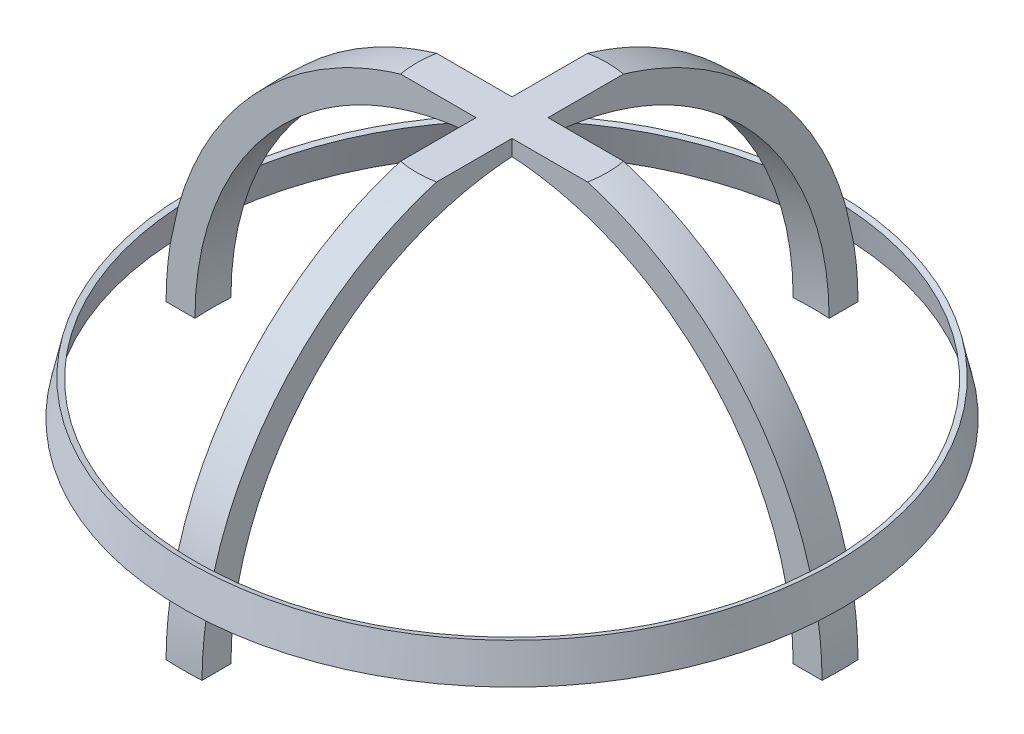
ISO-10303-21;
HEADER;
FILE_DESCRIPTION(('STEP AP214'),'2;1');
FILE_NAME('part.step','',(''),(''),'','','');
FILE_SCHEMA(('AUTOMOTIVE_DESIGN { 1 0 10303 214 1 1 1 1 }'));
ENDSEC;
DATA;
#1=APPLICATION_CONTEXT('core data for automotive mechanical design processes');
#2=APPLICATION_PROTOCOL_DEFINITION('international standard','automotive_design',2000,#1);
#3=PRODUCT_CONTEXT('',#1,'mechanical');
#4=PRODUCT('Part','Part','',(#3));
#5=PRODUCT_RELATED_PRODUCT_CATEGORY('part','',(#4));
#6=PRODUCT_DEFINITION_FORMATION('','',#4);
#7=PRODUCT_DEFINITION_CONTEXT('part definition',#1,'design');
#8=PRODUCT_DEFINITION('design','',#6,#7);
#9=PRODUCT_DEFINITION_SHAPE('','',#8);
#10=(LENGTH_UNIT() NAMED_UNIT(*) SI_UNIT(.MILLI.,.METRE.));
#11=(NAMED_UNIT(*) PLANE_ANGLE_UNIT() SI_UNIT($,.RADIAN.));
#12=(NAMED_UNIT(*) SI_UNIT($,.STERADIAN.) SOLID_ANGLE_UNIT());
#13=UNCERTAINTY_MEASURE_WITH_UNIT(LENGTH_MEASURE(1.E-05),#10,'distance_accuracy_value','');
#14=(GEOMETRIC_REPRESENTATION_CONTEXT(3) GLOBAL_UNCERTAINTY_ASSIGNED_CONTEXT((#13)) GLOBAL_UNIT_ASSIGNED_CONTEXT((#10,
#11,#12)) REPRESENTATION_CONTEXT('',''));
#15=CARTESIAN_POINT('',(0.,0.,0.));
#16=DIRECTION('',(0.,0.,1.));
#17=DIRECTION('',(1.,0.,0.));
#18=AXIS2_PLACEMENT_3D('',#15,#16,#17);
#19=CARTESIAN_POINT('',(0.,0.,0.));
#20=DIRECTION('',(0.,-1.,0.));
#21=DIRECTION('',(-1.,0.,0.));
#22=AXIS2_PLACEMENT_3D('',#19,#20,#21);
#23=SPHERICAL_SURFACE('',#22,54.8098082626001);
#24=CARTESIAN_POINT('',(0.,14.7077334629583,0.));
#25=DIRECTION('',(0.,-1.,0.));
#26=DIRECTION('',(0.,0.,-1.));
#27=AXIS2_PLACEMENT_3D('',#24,#25,#26);
#28=CIRCLE('',#27,52.7995990341363);
#29=CARTESIAN_POINT('',(-52.7143022164343,14.7077334629583,3.));
#30=VERTEX_POINT('',#29);
#31=CARTESIAN_POINT('',(-52.7143022164343,14.7077334629583,-3.));
#32=VERTEX_POINT('',#31);
#33=EDGE_CURVE('E250',#30,#32,#28,.T.);
#34=ORIENTED_EDGE('',*,*,#33,.F.);
#35=CARTESIAN_POINT('',(0.,0.,3.));
#36=DIRECTION('',(0.,0.,-1.));
#37=DIRECTION('',(-1.,0.,0.));
#38=AXIS2_PLACEMENT_3D('',#35,#36,#37);
#39=CIRCLE('',#38,54.7276445846429);
#40=CARTESIAN_POINT('',(-15.5977671461923,52.4578377541064,3.));
#41=VERTEX_POINT('',#40);
#42=EDGE_CURVE('E470',#30,#41,#39,.T.);
#43=ORIENTED_EDGE('',*,*,#42,.T.);
#44=CARTESIAN_POINT('',(0.,52.4578377541064,0.));
#45=DIRECTION('',(0.,-1.,0.));
#46=DIRECTION('',(0.,0.,-1.));
#47=AXIS2_PLACEMENT_3D('',#44,#45,#46);
#48=CIRCLE('',#47,15.8836500826113);
#49=CARTESIAN_POINT('',(-15.5977671461923,52.4578377541064,-3.));
#50=VERTEX_POINT('',#49);
#51=EDGE_CURVE('E424',#41,#50,#48,.T.);
#52=ORIENTED_EDGE('',*,*,#51,.T.);
#53=CARTESIAN_POINT('',(0.,0.,-3.));
#54=DIRECTION('',(0.,0.,1.));
#55=DIRECTION('',(1.,0.,0.));
#56=AXIS2_PLACEMENT_3D('',#53,#54,#55);
#57=CIRCLE('',#56,54.7276445846429);
#58=EDGE_CURVE('E515',#50,#32,#57,.T.);
#59=ORIENTED_EDGE('',*,*,#58,.T.);
#60=EDGE_LOOP('',(#34,#43,#52,#59));
#61=FACE_BOUND('',#60,.T.);
#62=ADVANCED_FACE('F39',(#61),#23,.T.);
#63=CARTESIAN_POINT('',(0.,8.84829183377712,0.));
#64=DIRECTION('',(0.,-1.,0.));
#65=DIRECTION('',(0.,0.,-1.));
#66=AXIS2_PLACEMENT_3D('',#63,#64,#65);
#67=CIRCLE('',#66,54.0908755097133);
#68=CARTESIAN_POINT('',(-54.0076181052942,8.84829183377719,3.));
#69=VERTEX_POINT('',#68);
#70=CARTESIAN_POINT('',(-54.0076181052942,8.84829183377712,-3.));
#71=VERTEX_POINT('',#70);
#72=EDGE_CURVE('E372',#69,#71,#67,.T.);
#73=ORIENTED_EDGE('',*,*,#72,.T.);
#74=CARTESIAN_POINT('',(-54.7276445846429,0.,-3.));
#75=VERTEX_POINT('',#74);
#76=EDGE_CURVE('E514',#71,#75,#57,.T.);
#77=ORIENTED_EDGE('',*,*,#76,.T.);
#78=CARTESIAN_POINT('',(0.,0.,0.));
#79=DIRECTION('',(0.,-1.,0.));
#80=DIRECTION('',(0.,0.,-1.));
#81=AXIS2_PLACEMENT_3D('',#78,#79,#80);
#82=CIRCLE('',#81,54.8098082626001);
#83=CARTESIAN_POINT('',(-54.7276445846429,0.,3.));
#84=VERTEX_POINT('',#83);
#85=EDGE_CURVE('E419',#84,#75,#82,.T.);
#86=ORIENTED_EDGE('',*,*,#85,.F.);
#87=EDGE_CURVE('E471',#84,#69,#39,.T.);
#88=ORIENTED_EDGE('',*,*,#87,.T.);
#89=EDGE_LOOP('',(#73,#77,#86,#88));
#90=FACE_BOUND('',#89,.T.);
#91=ADVANCED_FACE('F338',(#90),#23,.T.);
#92=CARTESIAN_POINT('',(-3.,14.7077334629583,-52.7143022164343));
#93=VERTEX_POINT('',#92);
#94=CARTESIAN_POINT('',(3.,14.7077334629583,-52.7143022164343));
#95=VERTEX_POINT('',#94);
#96=EDGE_CURVE('E245',#93,#95,#28,.T.);
#97=ORIENTED_EDGE('',*,*,#96,.F.);
#98=CARTESIAN_POINT('',(-3.,0.,0.));
#99=DIRECTION('',(1.,0.,0.));
#100=DIRECTION('',(0.,0.,-1.));
#101=AXIS2_PLACEMENT_3D('',#98,#99,#100);
#102=CIRCLE('',#101,54.7276445846429);
#103=CARTESIAN_POINT('',(-3.,52.4578377541064,-15.5977671461923));
#104=VERTEX_POINT('',#103);
#105=EDGE_CURVE('E465',#93,#104,#102,.T.);
#106=ORIENTED_EDGE('',*,*,#105,.T.);
#107=CARTESIAN_POINT('',(3.,52.4578377541064,-15.5977671461923));
#108=VERTEX_POINT('',#107);
#109=EDGE_CURVE('E526',#104,#108,#48,.T.);
#110=ORIENTED_EDGE('',*,*,#109,.T.);
#111=CARTESIAN_POINT('',(3.,0.,0.));
#112=DIRECTION('',(-1.,0.,0.));
#113=DIRECTION('',(0.,0.,1.));
#114=AXIS2_PLACEMENT_3D('',#111,#112,#113);
#115=CIRCLE('',#114,54.7276445846429);
#116=EDGE_CURVE('E507',#108,#95,#115,.T.);
#117=ORIENTED_EDGE('',*,*,#116,.T.);
#118=EDGE_LOOP('',(#97,#106,#110,#117));
#119=FACE_BOUND('',#118,.T.);
#120=ADVANCED_FACE('F344',(#119),#23,.T.);
#121=CARTESIAN_POINT('',(-3.,8.84829183377719,-54.0076181052942));
#122=VERTEX_POINT('',#121);
#123=CARTESIAN_POINT('',(3.,8.84829183377712,-54.0076181052942));
#124=VERTEX_POINT('',#123);
#125=EDGE_CURVE('E246',#122,#124,#67,.T.);
#126=ORIENTED_EDGE('',*,*,#125,.T.);
#127=CARTESIAN_POINT('',(3.,0.,-54.7276445846429));
#128=VERTEX_POINT('',#127);
#129=EDGE_CURVE('E506',#124,#128,#115,.T.);
#130=ORIENTED_EDGE('',*,*,#129,.T.);
#131=CARTESIAN_POINT('',(-3.,0.,-54.7276445846429));
#132=VERTEX_POINT('',#131);
#133=EDGE_CURVE('E534',#132,#128,#82,.T.);
#134=ORIENTED_EDGE('',*,*,#133,.F.);
#135=EDGE_CURVE('E460',#132,#122,#102,.T.);
#136=ORIENTED_EDGE('',*,*,#135,.T.);
#137=EDGE_LOOP('',(#126,#130,#134,#136));
#138=FACE_BOUND('',#137,.T.);
#139=ADVANCED_FACE('F549',(#138),#23,.T.);
#140=CARTESIAN_POINT('',(52.7143022164343,14.7077334629583,-3.));
#141=VERTEX_POINT('',#140);
#142=CARTESIAN_POINT('',(52.7143022164343,14.7077334629583,3.));
#143=VERTEX_POINT('',#142);
#144=EDGE_CURVE('E220',#141,#143,#28,.T.);
#145=ORIENTED_EDGE('',*,*,#144,.F.);
#146=CARTESIAN_POINT('',(0.,0.,-3.));
#147=DIRECTION('',(0.,0.,1.));
#148=DIRECTION('',(1.,0.,0.));
#149=AXIS2_PLACEMENT_3D('',#146,#147,#148);
#150=CIRCLE('',#149,54.7276445846429);
#151=CARTESIAN_POINT('',(15.5977671461923,52.4578377541064,-3.));
#152=VERTEX_POINT('',#151);
#153=EDGE_CURVE('E205',#141,#152,#150,.T.);
#154=ORIENTED_EDGE('',*,*,#153,.T.);
#155=CARTESIAN_POINT('',(15.5977671461923,52.4578377541064,3.));
#156=VERTEX_POINT('',#155);
#157=EDGE_CURVE('E418',#152,#156,#48,.T.);
#158=ORIENTED_EDGE('',*,*,#157,.T.);
#159=CARTESIAN_POINT('',(0.,0.,3.));
#160=DIRECTION('',(0.,0.,-1.));
#161=DIRECTION('',(-1.,0.,0.));
#162=AXIS2_PLACEMENT_3D('',#159,#160,#161);
#163=CIRCLE('',#162,54.7276445846429);
#164=EDGE_CURVE('E223',#156,#143,#163,.T.);
#165=ORIENTED_EDGE('',*,*,#164,.T.);
#166=EDGE_LOOP('',(#145,#154,#158,#165));
#167=FACE_BOUND('',#166,.T.);
#168=ADVANCED_FACE('F221',(#167),#23,.T.);
#169=CARTESIAN_POINT('',(54.0076181052942,8.84829183377719,-3.));
#170=VERTEX_POINT('',#169);
#171=CARTESIAN_POINT('',(54.0076181052942,8.84829183377712,3.));
#172=VERTEX_POINT('',#171);
#173=EDGE_CURVE('E375',#170,#172,#67,.T.);
#174=ORIENTED_EDGE('',*,*,#173,.T.);
#175=CARTESIAN_POINT('',(54.7276445846429,0.,3.));
#176=VERTEX_POINT('',#175);
#177=EDGE_CURVE('E392',#172,#176,#163,.T.);
#178=ORIENTED_EDGE('',*,*,#177,.T.);
#179=CARTESIAN_POINT('',(54.7276445846429,0.,-3.));
#180=VERTEX_POINT('',#179);
#181=EDGE_CURVE('E413',#180,#176,#82,.T.);
#182=ORIENTED_EDGE('',*,*,#181,.F.);
#183=EDGE_CURVE('E215',#180,#170,#150,.T.);
#184=ORIENTED_EDGE('',*,*,#183,.T.);
#185=EDGE_LOOP('',(#174,#178,#182,#184));
#186=FACE_BOUND('',#185,.T.);
#187=ADVANCED_FACE('F354',(#186),#23,.T.);
#188=CARTESIAN_POINT('',(3.,14.7077334629583,52.7143022164343));
#189=VERTEX_POINT('',#188);
#190=CARTESIAN_POINT('',(-3.,14.7077334629583,52.7143022164343));
#191=VERTEX_POINT('',#190);
#192=EDGE_CURVE('E59',#189,#191,#28,.T.);
#193=ORIENTED_EDGE('',*,*,#192,.F.);
#194=CARTESIAN_POINT('',(3.,0.,0.));
#195=DIRECTION('',(-1.,0.,0.));
#196=DIRECTION('',(0.,0.,1.));
#197=AXIS2_PLACEMENT_3D('',#194,#195,#196);
#198=CIRCLE('',#197,54.7276445846429);
#199=CARTESIAN_POINT('',(3.,52.4578377541064,15.5977671461923));
#200=VERTEX_POINT('',#199);
#201=EDGE_CURVE('E407',#189,#200,#198,.T.);
#202=ORIENTED_EDGE('',*,*,#201,.T.);
#203=CARTESIAN_POINT('',(-3.,52.4578377541064,15.5977671461923));
#204=VERTEX_POINT('',#203);
#205=EDGE_CURVE('E420',#200,#204,#48,.T.);
#206=ORIENTED_EDGE('',*,*,#205,.T.);
#207=CARTESIAN_POINT('',(-3.,0.,0.));
#208=DIRECTION('',(1.,0.,0.));
#209=DIRECTION('',(0.,0.,-1.));
#210=AXIS2_PLACEMENT_3D('',#207,#208,#209);
#211=CIRCLE('',#210,54.7276445846429);
#212=EDGE_CURVE('E462',#204,#191,#211,.T.);
#213=ORIENTED_EDGE('',*,*,#212,.T.);
#214=EDGE_LOOP('',(#193,#202,#206,#213));
#215=FACE_BOUND('',#214,.T.);
#216=ADVANCED_FACE('F348',(#215),#23,.T.);
#217=CARTESIAN_POINT('',(3.,8.84829183377719,54.0076181052942));
#218=VERTEX_POINT('',#217);
#219=CARTESIAN_POINT('',(-3.,8.84829183377712,54.0076181052942));
#220=VERTEX_POINT('',#219);
#221=EDGE_CURVE('E357',#218,#220,#67,.T.);
#222=ORIENTED_EDGE('',*,*,#221,.T.);
#223=CARTESIAN_POINT('',(-3.,0.,54.7276445846429));
#224=VERTEX_POINT('',#223);
#225=EDGE_CURVE('E359',#220,#224,#211,.T.);
#226=ORIENTED_EDGE('',*,*,#225,.T.);
#227=CARTESIAN_POINT('',(3.,0.,54.7276445846429));
#228=VERTEX_POINT('',#227);
#229=EDGE_CURVE('E415',#228,#224,#82,.T.);
#230=ORIENTED_EDGE('',*,*,#229,.F.);
#231=EDGE_CURVE('E361',#228,#218,#198,.T.);
#232=ORIENTED_EDGE('',*,*,#231,.T.);
#233=EDGE_LOOP('',(#222,#226,#230,#232));
#234=FACE_BOUND('',#233,.T.);
#235=ADVANCED_FACE('F340',(#234),#23,.T.);
#236=CARTESIAN_POINT('',(3.,-47.5421622458936,16.5280143442534));
#237=DIRECTION('',(-1.,0.,0.));
#238=DIRECTION('',(0.,0.,1.));
#239=AXIS2_PLACEMENT_3D('',#236,#237,#238);
#240=PLANE('',#239);
#241=CARTESIAN_POINT('',(3.,-78.4607083011719,73.2702358494606));
#242=CARTESIAN_POINT('',(3.,-70.841456450407,71.5897329981205));
#243=CARTESIAN_POINT('',(3.,-63.2222244824851,69.909140007067));
#244=CARTESIAN_POINT('',(3.,-47.983811227918,66.5477242185315));
#245=CARTESIAN_POINT('',(3.,-40.3646299412731,64.8669014210492));
#246=CARTESIAN_POINT('',(3.,-17.5071788666337,59.8240141144965));
#247=CARTESIAN_POINT('',(3.,-2.26900150710761,56.4615306126234));
#248=CARTESIAN_POINT('',(3.,20.5879508588435,51.4163833156868));
#249=CARTESIAN_POINT('',(3.,28.2068827991617,49.734430521214));
#250=CARTESIAN_POINT('',(3.,43.44460333828,46.369875862958));
#251=CARTESIAN_POINT('',(3.,51.0633919370807,44.6872739991771));
#252=CARTESIAN_POINT('',(3.,66.3007709097612,41.3211720179606));
#253=CARTESIAN_POINT('',(3.,73.9193612836363,39.6376719005038));
#254=CARTESIAN_POINT('',(3.,85.3470297795611,37.1114395676625));
#255=CARTESIAN_POINT('',(3.,89.1562164570464,36.2691984255194));
#256=CARTESIAN_POINT('',(3.,96.7744991384305,34.5843060963235));
#257=CARTESIAN_POINT('',(3.,100.583595142329,33.7416549092692));
#258=CARTESIAN_POINT('',(3.,104.392636643225,32.8987573716095));
#259=B_SPLINE_CURVE_WITH_KNOTS('',3,(#241,#242,#243,#244,#245,#246,#247,#248,#249,#250,#251,
#252,#253,#254,#255,#256,#257,#258),.UNSPECIFIED.,.F.,.F.,(4,2,2,2,2,2,2,2,4),(0.,
23.4071313316642,46.8142626972976,93.6285243323567,117.035655747289,140.442787077746,
163.849918964681,175.553485049434,187.257051178928),.UNSPECIFIED.);
#260=EDGE_CURVE('E66',#218,#189,#259,.T.);
#261=ORIENTED_EDGE('',*,*,#260,.F.);
#262=ORIENTED_EDGE('',*,*,#231,.F.);
#263=DIRECTION('',(0.,0.,1.));
#264=VECTOR('',#263,1.);
#265=CARTESIAN_POINT('',(3.,0.,0.));
#266=LINE('',#265,#264);
#267=CARTESIAN_POINT('',(3.,0.,49.9099188538711));
#268=VERTEX_POINT('',#267);
#269=EDGE_CURVE('E400',#268,#228,#266,.T.);
#270=ORIENTED_EDGE('',*,*,#269,.F.);
#271=CARTESIAN_POINT('',(3.,0.,0.));
#272=DIRECTION('',(-1.,0.,0.));
#273=DIRECTION('',(0.,0.,1.));
#274=AXIS2_PLACEMENT_3D('',#271,#272,#273);
#275=CIRCLE('',#274,49.9099188538711);
#276=CARTESIAN_POINT('',(3.,49.8196748283246,3.));
#277=VERTEX_POINT('',#276);
#278=EDGE_CURVE('E426',#268,#277,#275,.T.);
#279=ORIENTED_EDGE('',*,*,#278,.T.);
#280=DIRECTION('',(0.,1.,0.));
#281=VECTOR('',#280,1.);
#282=CARTESIAN_POINT('',(3.,-47.5421622458936,3.));
#283=LINE('',#282,#281);
#284=CARTESIAN_POINT('',(3.,52.4578377541064,3.));
#285=VERTEX_POINT('',#284);
#286=EDGE_CURVE('E401',#277,#285,#283,.T.);
#287=ORIENTED_EDGE('',*,*,#286,.T.);
#288=DIRECTION('',(0.,0.,1.));
#289=VECTOR('',#288,1.);
#290=CARTESIAN_POINT('',(3.,52.4578377541064,16.5280143442534));
#291=LINE('',#290,#289);
#292=EDGE_CURVE('E477',#285,#200,#291,.T.);
#293=ORIENTED_EDGE('',*,*,#292,.T.);
#294=ORIENTED_EDGE('',*,*,#201,.F.);
#295=EDGE_LOOP('',(#261,#262,#270,#279,#287,#293,#294));
#296=FACE_BOUND('',#295,.T.);
#297=ADVANCED_FACE('F279',(#296),#240,.F.);
#298=CARTESIAN_POINT('',(3.,-47.5421622458936,3.));
#299=DIRECTION('',(0.,0.,-1.));
#300=DIRECTION('',(-1.,0.,0.));
#301=AXIS2_PLACEMENT_3D('',#298,#299,#300);
#302=PLANE('',#301);
#303=CARTESIAN_POINT('',(32.8987573716095,104.392636643225,3.));
#304=CARTESIAN_POINT('',(33.8776869663045,99.9688576139226,3.));
#305=CARTESIAN_POINT('',(34.8562875455616,95.5450057967239,3.));
#306=CARTESIAN_POINT('',(36.8129534164412,86.6971838056494,3.));
#307=CARTESIAN_POINT('',(37.7910187080662,82.2732136317742,3.));
#308=CARTESIAN_POINT('',(40.724595749769,69.0011664788794,3.));
#309=CARTESIAN_POINT('',(42.6794886978138,60.1529527278342,3.));
#310=CARTESIAN_POINT('',(46.0450316885042,44.9154503158348,3.));
#311=CARTESIAN_POINT('',(47.4559405567881,38.5262188147569,3.));
#312=CARTESIAN_POINT('',(50.2773215311637,25.7476593381671,3.));
#313=CARTESIAN_POINT('',(51.6877936372528,19.3583313626546,3.));
#314=CARTESIAN_POINT('',(56.4615305515347,-2.26900185158538,3.));
#315=CARTESIAN_POINT('',(59.8240142277862,-17.5071795045442,3.));
#316=CARTESIAN_POINT('',(64.866901608454,-40.3646307287639,3.));
#317=CARTESIAN_POINT('',(66.5477243645427,-47.9838118587946,3.));
#318=CARTESIAN_POINT('',(69.9091400702767,-63.2222248000766,3.));
#319=CARTESIAN_POINT('',(71.5897330199224,-70.8414566113279,3.));
#320=CARTESIAN_POINT('',(73.2702358494606,-78.4607083011719,3.));
#321=B_SPLINE_CURVE_WITH_KNOTS('',3,(#303,#304,#305,#306,#307,#308,#309,#310,#311,#312,#313,
#314,#315,#316,#317,#318,#319,#320),.UNSPECIFIED.,.F.,.F.,(4,2,2,2,2,2,2,2,4),(0.,
13.5923918192086,27.1847835711406,54.3695666425258,73.9990466815697,93.6285268420098,
140.442789448223,163.849920328366,187.257051174366),.UNSPECIFIED.);
#322=EDGE_CURVE('E238',#143,#172,#321,.T.);
#323=ORIENTED_EDGE('',*,*,#322,.F.);
#324=ORIENTED_EDGE('',*,*,#164,.F.);
#325=DIRECTION('',(-1.,0.,0.));
#326=VECTOR('',#325,1.);
#327=CARTESIAN_POINT('',(3.,52.4578377541064,3.));
#328=LINE('',#327,#326);
#329=EDGE_CURVE('E474',#156,#285,#328,.T.);
#330=ORIENTED_EDGE('',*,*,#329,.T.);
#331=ORIENTED_EDGE('',*,*,#286,.F.);
#332=CARTESIAN_POINT('',(0.,0.,3.));
#333=DIRECTION('',(0.,0.,-1.));
#334=DIRECTION('',(-1.,0.,0.));
#335=AXIS2_PLACEMENT_3D('',#332,#333,#334);
#336=CIRCLE('',#335,49.9099188538711);
#337=CARTESIAN_POINT('',(49.9099188538711,0.,3.));
#338=VERTEX_POINT('',#337);
#339=EDGE_CURVE('E423',#277,#338,#336,.T.);
#340=ORIENTED_EDGE('',*,*,#339,.T.);
#341=DIRECTION('',(-1.,0.,0.));
#342=VECTOR('',#341,1.);
#343=CARTESIAN_POINT('',(0.,0.,3.));
#344=LINE('',#343,#342);
#345=EDGE_CURVE('E398',#176,#338,#344,.T.);
#346=ORIENTED_EDGE('',*,*,#345,.F.);
#347=ORIENTED_EDGE('',*,*,#177,.F.);
#348=EDGE_LOOP('',(#323,#324,#330,#331,#340,#346,#347));
#349=FACE_BOUND('',#348,.T.);
#350=ADVANCED_FACE('F326',(#349),#302,.F.);
#351=CARTESIAN_POINT('',(3.,-47.5421622458936,-3.));
#352=DIRECTION('',(0.,0.,1.));
#353=DIRECTION('',(1.,0.,0.));
#354=AXIS2_PLACEMENT_3D('',#351,#352,#353);
#355=PLANE('',#354);
#356=CARTESIAN_POINT('',(73.2702358494606,-78.4607083011719,-3.));
#357=CARTESIAN_POINT('',(71.5897329981205,-70.841456450407,-3.));
#358=CARTESIAN_POINT('',(69.909140007067,-63.2222244824851,-3.));
#359=CARTESIAN_POINT('',(66.5477242185315,-47.983811227918,-3.));
#360=CARTESIAN_POINT('',(64.8669014210492,-40.3646299412731,-3.));
#361=CARTESIAN_POINT('',(59.8240141144965,-17.5071788666337,-3.));
#362=CARTESIAN_POINT('',(56.4615306126234,-2.26900150710761,-3.));
#363=CARTESIAN_POINT('',(51.4163833156868,20.5879508588435,-3.));
#364=CARTESIAN_POINT('',(49.734430521214,28.2068827991617,-3.));
#365=CARTESIAN_POINT('',(46.369875862958,43.44460333828,-3.));
#366=CARTESIAN_POINT('',(44.6872739991771,51.0633919370807,-3.));
#367=CARTESIAN_POINT('',(41.3211720179606,66.3007709097612,-3.));
#368=CARTESIAN_POINT('',(39.6376719005038,73.9193612836363,-3.));
#369=CARTESIAN_POINT('',(37.1114395676625,85.3470297795611,-3.));
#370=CARTESIAN_POINT('',(36.2691984255194,89.1562164570464,-3.));
#371=CARTESIAN_POINT('',(34.5843060963235,96.7744991384305,-3.));
#372=CARTESIAN_POINT('',(33.7416549092692,100.583595142329,-3.));
#373=CARTESIAN_POINT('',(32.8987573716095,104.392636643225,-3.));
#374=B_SPLINE_CURVE_WITH_KNOTS('',3,(#356,#357,#358,#359,#360,#361,#362,#363,#364,#365,#366,
#367,#368,#369,#370,#371,#372,#373),.UNSPECIFIED.,.F.,.F.,(4,2,2,2,2,2,2,2,4),(0.,
23.4071313316642,46.8142626972976,93.6285243323567,117.035655747289,140.442787077746,
163.849918964681,175.553485049434,187.257051178928),.UNSPECIFIED.);
#375=EDGE_CURVE('E209',#170,#141,#374,.T.);
#376=ORIENTED_EDGE('',*,*,#375,.F.);
#377=ORIENTED_EDGE('',*,*,#183,.F.);
#378=DIRECTION('',(1.,0.,0.));
#379=VECTOR('',#378,1.);
#380=CARTESIAN_POINT('',(0.,0.,-3.));
#381=LINE('',#380,#379);
#382=CARTESIAN_POINT('',(49.9099188538711,0.,-3.));
#383=VERTEX_POINT('',#382);
#384=EDGE_CURVE('E216',#383,#180,#381,.T.);
#385=ORIENTED_EDGE('',*,*,#384,.F.);
#386=CARTESIAN_POINT('',(0.,0.,-3.));
#387=DIRECTION('',(0.,0.,1.));
#388=DIRECTION('',(1.,0.,0.));
#389=AXIS2_PLACEMENT_3D('',#386,#387,#388);
#390=CIRCLE('',#389,49.9099188538711);
#391=CARTESIAN_POINT('',(3.,49.8196748283246,-3.));
#392=VERTEX_POINT('',#391);
#393=EDGE_CURVE('E431',#383,#392,#390,.T.);
#394=ORIENTED_EDGE('',*,*,#393,.T.);
#395=DIRECTION('',(0.,1.,0.));
#396=VECTOR('',#395,1.);
#397=CARTESIAN_POINT('',(3.,-47.5421622458936,-3.));
#398=LINE('',#397,#396);
#399=CARTESIAN_POINT('',(3.,52.4578377541064,-3.));
#400=VERTEX_POINT('',#399);
#401=EDGE_CURVE('E498',#392,#400,#398,.T.);
#402=ORIENTED_EDGE('',*,*,#401,.T.);
#403=DIRECTION('',(1.,0.,0.));
#404=VECTOR('',#403,1.);
#405=CARTESIAN_POINT('',(3.,52.4578377541064,-3.));
#406=LINE('',#405,#404);
#407=EDGE_CURVE('E212',#400,#152,#406,.T.);
#408=ORIENTED_EDGE('',*,*,#407,.T.);
#409=ORIENTED_EDGE('',*,*,#153,.F.);
#410=EDGE_LOOP('',(#376,#377,#385,#394,#402,#408,#409));
#411=FACE_BOUND('',#410,.T.);
#412=ADVANCED_FACE('F207',(#411),#355,.F.);
#413=CARTESIAN_POINT('',(3.,-47.5421622458936,-3.));
#414=DIRECTION('',(-1.,0.,0.));
#415=DIRECTION('',(0.,0.,1.));
#416=AXIS2_PLACEMENT_3D('',#413,#414,#415);
#417=PLANE('',#416);
#418=CARTESIAN_POINT('',(3.,104.392636643225,-32.8987573716095));
#419=CARTESIAN_POINT('',(3.,99.9688576139226,-33.8776869663045));
#420=CARTESIAN_POINT('',(3.,95.5450057967239,-34.8562875455616));
#421=CARTESIAN_POINT('',(3.,86.6971838056494,-36.8129534164412));
#422=CARTESIAN_POINT('',(3.,82.2732136317742,-37.7910187080662));
#423=CARTESIAN_POINT('',(3.,69.0011664788794,-40.724595749769));
#424=CARTESIAN_POINT('',(3.,60.1529527278342,-42.6794886978138));
#425=CARTESIAN_POINT('',(3.,44.9154503158348,-46.0450316885042));
#426=CARTESIAN_POINT('',(3.,38.5262188147569,-47.4559405567881));
#427=CARTESIAN_POINT('',(3.,25.7476593381671,-50.2773215311637));
#428=CARTESIAN_POINT('',(3.,19.3583313626546,-51.6877936372528));
#429=CARTESIAN_POINT('',(3.,-2.26900185158538,-56.4615305515347));
#430=CARTESIAN_POINT('',(3.,-17.5071795045442,-59.8240142277862));
#431=CARTESIAN_POINT('',(3.,-40.3646307287639,-64.866901608454));
#432=CARTESIAN_POINT('',(3.,-47.9838118587946,-66.5477243645427));
#433=CARTESIAN_POINT('',(3.,-63.2222248000766,-69.9091400702767));
#434=CARTESIAN_POINT('',(3.,-70.8414566113279,-71.5897330199224));
#435=CARTESIAN_POINT('',(3.,-78.4607083011719,-73.2702358494606));
#436=B_SPLINE_CURVE_WITH_KNOTS('',3,(#418,#419,#420,#421,#422,#423,#424,#425,#426,#427,#428,
#429,#430,#431,#432,#433,#434,#435),.UNSPECIFIED.,.F.,.F.,(4,2,2,2,2,2,2,2,4),(0.,
13.5923918192086,27.1847835711406,54.3695666425258,73.9990466815697,93.6285268420098,
140.442789448223,163.849920328366,187.257051174366),.UNSPECIFIED.);
#437=EDGE_CURVE('E239',#95,#124,#436,.T.);
#438=ORIENTED_EDGE('',*,*,#437,.F.);
#439=ORIENTED_EDGE('',*,*,#116,.F.);
#440=DIRECTION('',(0.,0.,1.));
#441=VECTOR('',#440,1.);
#442=CARTESIAN_POINT('',(3.,52.4578377541064,-3.));
#443=LINE('',#442,#441);
#444=EDGE_CURVE('E263',#108,#400,#443,.T.);
#445=ORIENTED_EDGE('',*,*,#444,.T.);
#446=ORIENTED_EDGE('',*,*,#401,.F.);
#447=CARTESIAN_POINT('',(3.,0.,0.));
#448=DIRECTION('',(-1.,0.,0.));
#449=DIRECTION('',(0.,0.,1.));
#450=AXIS2_PLACEMENT_3D('',#447,#448,#449);
#451=CIRCLE('',#450,49.9099188538711);
#452=CARTESIAN_POINT('',(3.,0.,-49.9099188538711));
#453=VERTEX_POINT('',#452);
#454=EDGE_CURVE('E429',#392,#453,#451,.T.);
#455=ORIENTED_EDGE('',*,*,#454,.T.);
#456=DIRECTION('',(0.,0.,1.));
#457=VECTOR('',#456,1.);
#458=CARTESIAN_POINT('',(3.,0.,0.));
#459=LINE('',#458,#457);
#460=EDGE_CURVE('E491',#128,#453,#459,.T.);
#461=ORIENTED_EDGE('',*,*,#460,.F.);
#462=ORIENTED_EDGE('',*,*,#129,.F.);
#463=EDGE_LOOP('',(#438,#439,#445,#446,#455,#461,#462));
#464=FACE_BOUND('',#463,.T.);
#465=ADVANCED_FACE('F325',(#464),#417,.F.);
#466=CARTESIAN_POINT('',(-3.,-47.5421622458936,-16.5280143442534));
#467=DIRECTION('',(1.,0.,0.));
#468=DIRECTION('',(0.,0.,-1.));
#469=AXIS2_PLACEMENT_3D('',#466,#467,#468);
#470=PLANE('',#469);
#471=CARTESIAN_POINT('',(-3.,-78.4607083011719,-73.2702358494606));
#472=CARTESIAN_POINT('',(-3.,-70.841456450407,-71.5897329981205));
#473=CARTESIAN_POINT('',(-3.,-63.2222244824851,-69.909140007067));
#474=CARTESIAN_POINT('',(-3.,-47.983811227918,-66.5477242185315));
#475=CARTESIAN_POINT('',(-3.,-40.3646299412731,-64.8669014210492));
#476=CARTESIAN_POINT('',(-3.,-17.5071788666337,-59.8240141144965));
#477=CARTESIAN_POINT('',(-3.,-2.26900150710761,-56.4615306126234));
#478=CARTESIAN_POINT('',(-3.,20.5879508588435,-51.4163833156868));
#479=CARTESIAN_POINT('',(-3.,28.2068827991617,-49.734430521214));
#480=CARTESIAN_POINT('',(-3.,43.44460333828,-46.369875862958));
#481=CARTESIAN_POINT('',(-3.,51.0633919370807,-44.6872739991771));
#482=CARTESIAN_POINT('',(-3.,66.3007709097612,-41.3211720179606));
#483=CARTESIAN_POINT('',(-3.,73.9193612836363,-39.6376719005038));
#484=CARTESIAN_POINT('',(-3.,85.3470297795611,-37.1114395676625));
#485=CARTESIAN_POINT('',(-3.,89.1562164570464,-36.2691984255194));
#486=CARTESIAN_POINT('',(-3.,96.7744991384305,-34.5843060963235));
#487=CARTESIAN_POINT('',(-3.,100.583595142329,-33.7416549092692));
#488=CARTESIAN_POINT('',(-3.,104.392636643225,-32.8987573716095));
#489=B_SPLINE_CURVE_WITH_KNOTS('',3,(#471,#472,#473,#474,#475,#476,#477,#478,#479,#480,#481,
#482,#483,#484,#485,#486,#487,#488),.UNSPECIFIED.,.F.,.F.,(4,2,2,2,2,2,2,2,4),(0.,
23.4071313316642,46.8142626972976,93.6285243323567,117.035655747289,140.442787077746,
163.849918964681,175.553485049434,187.257051178928),.UNSPECIFIED.);
#490=EDGE_CURVE('E309',#122,#93,#489,.T.);
#491=ORIENTED_EDGE('',*,*,#490,.F.);
#492=ORIENTED_EDGE('',*,*,#135,.F.);
#493=DIRECTION('',(0.,0.,-1.));
#494=VECTOR('',#493,1.);
#495=CARTESIAN_POINT('',(-3.,0.,0.));
#496=LINE('',#495,#494);
#497=CARTESIAN_POINT('',(-3.,0.,-49.9099188538711));
#498=VERTEX_POINT('',#497);
#499=EDGE_CURVE('E517',#498,#132,#496,.T.);
#500=ORIENTED_EDGE('',*,*,#499,.F.);
#501=CARTESIAN_POINT('',(-3.,0.,0.));
#502=DIRECTION('',(1.,0.,0.));
#503=DIRECTION('',(0.,0.,-1.));
#504=AXIS2_PLACEMENT_3D('',#501,#502,#503);
#505=CIRCLE('',#504,49.9099188538711);
#506=CARTESIAN_POINT('',(-3.,49.8196748283246,-3.));
#507=VERTEX_POINT('',#506);
#508=EDGE_CURVE('E436',#498,#507,#505,.T.);
#509=ORIENTED_EDGE('',*,*,#508,.T.);
#510=DIRECTION('',(0.,1.,0.));
#511=VECTOR('',#510,1.);
#512=CARTESIAN_POINT('',(-3.,-47.5421622458936,-3.));
#513=LINE('',#512,#511);
#514=CARTESIAN_POINT('',(-3.,52.4578377541064,-3.));
#515=VERTEX_POINT('',#514);
#516=EDGE_CURVE('E487',#507,#515,#513,.T.);
#517=ORIENTED_EDGE('',*,*,#516,.T.);
#518=DIRECTION('',(0.,0.,-1.));
#519=VECTOR('',#518,1.);
#520=CARTESIAN_POINT('',(-3.,52.4578377541064,-16.5280143442534));
#521=LINE('',#520,#519);
#522=EDGE_CURVE('E497',#515,#104,#521,.T.);
#523=ORIENTED_EDGE('',*,*,#522,.T.);
#524=ORIENTED_EDGE('',*,*,#105,.F.);
#525=EDGE_LOOP('',(#491,#492,#500,#509,#517,#523,#524));
#526=FACE_BOUND('',#525,.T.);
#527=ADVANCED_FACE('F331',(#526),#470,.F.);
#528=CARTESIAN_POINT('',(-3.,-47.5421622458936,-3.));
#529=DIRECTION('',(0.,0.,1.));
#530=DIRECTION('',(1.,0.,0.));
#531=AXIS2_PLACEMENT_3D('',#528,#529,#530);
#532=PLANE('',#531);
#533=CARTESIAN_POINT('',(-32.8987573716095,104.392636643225,-3.));
#534=CARTESIAN_POINT('',(-33.8776869663045,99.9688576139226,-3.));
#535=CARTESIAN_POINT('',(-34.8562875455616,95.5450057967239,-3.));
#536=CARTESIAN_POINT('',(-36.8129534164412,86.6971838056494,-3.));
#537=CARTESIAN_POINT('',(-37.7910187080662,82.2732136317742,-3.));
#538=CARTESIAN_POINT('',(-40.724595749769,69.0011664788794,-3.));
#539=CARTESIAN_POINT('',(-42.6794886978138,60.1529527278342,-3.));
#540=CARTESIAN_POINT('',(-46.0450316885042,44.9154503158348,-3.));
#541=CARTESIAN_POINT('',(-47.4559405567881,38.5262188147569,-3.));
#542=CARTESIAN_POINT('',(-50.2773215311637,25.7476593381671,-3.));
#543=CARTESIAN_POINT('',(-51.6877936372528,19.3583313626546,-3.));
#544=CARTESIAN_POINT('',(-56.4615305515347,-2.26900185158538,-3.));
#545=CARTESIAN_POINT('',(-59.8240142277862,-17.5071795045442,-3.));
#546=CARTESIAN_POINT('',(-64.866901608454,-40.3646307287639,-3.));
#547=CARTESIAN_POINT('',(-66.5477243645427,-47.9838118587946,-3.));
#548=CARTESIAN_POINT('',(-69.9091400702767,-63.2222248000766,-3.));
#549=CARTESIAN_POINT('',(-71.5897330199224,-70.8414566113279,-3.));
#550=CARTESIAN_POINT('',(-73.2702358494606,-78.4607083011719,-3.));
#551=B_SPLINE_CURVE_WITH_KNOTS('',3,(#533,#534,#535,#536,#537,#538,#539,#540,#541,#542,#543,
#544,#545,#546,#547,#548,#549,#550),.UNSPECIFIED.,.F.,.F.,(4,2,2,2,2,2,2,2,4),(0.,
13.5923918192086,27.1847835711406,54.3695666425258,73.9990466815697,93.6285268420098,
140.442789448223,163.849920328366,187.257051174366),.UNSPECIFIED.);
#552=EDGE_CURVE('E302',#32,#71,#551,.T.);
#553=ORIENTED_EDGE('',*,*,#552,.F.);
#554=ORIENTED_EDGE('',*,*,#58,.F.);
#555=DIRECTION('',(1.,0.,0.));
#556=VECTOR('',#555,1.);
#557=CARTESIAN_POINT('',(-3.,52.4578377541064,-3.));
#558=LINE('',#557,#556);
#559=EDGE_CURVE('E494',#50,#515,#558,.T.);
#560=ORIENTED_EDGE('',*,*,#559,.T.);
#561=ORIENTED_EDGE('',*,*,#516,.F.);
#562=CARTESIAN_POINT('',(0.,0.,-3.));
#563=DIRECTION('',(0.,0.,1.));
#564=DIRECTION('',(1.,0.,0.));
#565=AXIS2_PLACEMENT_3D('',#562,#563,#564);
#566=CIRCLE('',#565,49.9099188538711);
#567=CARTESIAN_POINT('',(-49.9099188538711,0.,-3.));
#568=VERTEX_POINT('',#567);
#569=EDGE_CURVE('E434',#507,#568,#566,.T.);
#570=ORIENTED_EDGE('',*,*,#569,.T.);
#571=DIRECTION('',(1.,0.,0.));
#572=VECTOR('',#571,1.);
#573=CARTESIAN_POINT('',(0.,0.,-3.));
#574=LINE('',#573,#572);
#575=EDGE_CURVE('E511',#75,#568,#574,.T.);
#576=ORIENTED_EDGE('',*,*,#575,.F.);
#577=ORIENTED_EDGE('',*,*,#76,.F.);
#578=EDGE_LOOP('',(#553,#554,#560,#561,#570,#576,#577));
#579=FACE_BOUND('',#578,.T.);
#580=ADVANCED_FACE('F327',(#579),#532,.F.);
#581=CARTESIAN_POINT('',(-16.5280143442534,-47.5421622458936,3.));
#582=DIRECTION('',(0.,0.,-1.));
#583=DIRECTION('',(-1.,0.,0.));
#584=AXIS2_PLACEMENT_3D('',#581,#582,#583);
#585=PLANE('',#584);
#586=CARTESIAN_POINT('',(-73.2702358494606,-78.4607083011719,3.));
#587=CARTESIAN_POINT('',(-71.5897329981205,-70.841456450407,3.));
#588=CARTESIAN_POINT('',(-69.909140007067,-63.2222244824851,3.));
#589=CARTESIAN_POINT('',(-66.5477242185315,-47.983811227918,3.));
#590=CARTESIAN_POINT('',(-64.8669014210492,-40.3646299412731,3.));
#591=CARTESIAN_POINT('',(-59.8240141144965,-17.5071788666337,3.));
#592=CARTESIAN_POINT('',(-56.4615306126234,-2.26900150710761,3.));
#593=CARTESIAN_POINT('',(-51.4163833156868,20.5879508588435,3.));
#594=CARTESIAN_POINT('',(-49.734430521214,28.2068827991617,3.));
#595=CARTESIAN_POINT('',(-46.369875862958,43.44460333828,3.));
#596=CARTESIAN_POINT('',(-44.6872739991771,51.0633919370807,3.));
#597=CARTESIAN_POINT('',(-41.3211720179606,66.3007709097612,3.));
#598=CARTESIAN_POINT('',(-39.6376719005038,73.9193612836363,3.));
#599=CARTESIAN_POINT('',(-37.1114395676625,85.3470297795611,3.));
#600=CARTESIAN_POINT('',(-36.2691984255194,89.1562164570464,3.));
#601=CARTESIAN_POINT('',(-34.5843060963235,96.7744991384305,3.));
#602=CARTESIAN_POINT('',(-33.7416549092692,100.583595142329,3.));
#603=CARTESIAN_POINT('',(-32.8987573716095,104.392636643225,3.));
#604=B_SPLINE_CURVE_WITH_KNOTS('',3,(#586,#587,#588,#589,#590,#591,#592,#593,#594,#595,#596,
#597,#598,#599,#600,#601,#602,#603),.UNSPECIFIED.,.F.,.F.,(4,2,2,2,2,2,2,2,4),(0.,
23.4071313316642,46.8142626972976,93.6285243323567,117.035655747289,140.442787077746,
163.849918964681,175.553485049434,187.257051178928),.UNSPECIFIED.);
#605=EDGE_CURVE('E294',#69,#30,#604,.T.);
#606=ORIENTED_EDGE('',*,*,#605,.F.);
#607=ORIENTED_EDGE('',*,*,#87,.F.);
#608=DIRECTION('',(-1.,0.,0.));
#609=VECTOR('',#608,1.);
#610=CARTESIAN_POINT('',(0.,0.,3.));
#611=LINE('',#610,#609);
#612=CARTESIAN_POINT('',(-49.9099188538711,0.,3.));
#613=VERTEX_POINT('',#612);
#614=EDGE_CURVE('E449',#613,#84,#611,.T.);
#615=ORIENTED_EDGE('',*,*,#614,.F.);
#616=CARTESIAN_POINT('',(0.,0.,3.));
#617=DIRECTION('',(0.,0.,-1.));
#618=DIRECTION('',(-1.,0.,0.));
#619=AXIS2_PLACEMENT_3D('',#616,#617,#618);
#620=CIRCLE('',#619,49.9099188538711);
#621=CARTESIAN_POINT('',(-3.,49.8196748283246,3.));
#622=VERTEX_POINT('',#621);
#623=EDGE_CURVE('E52',#613,#622,#620,.T.);
#624=ORIENTED_EDGE('',*,*,#623,.T.);
#625=DIRECTION('',(0.,1.,0.));
#626=VECTOR('',#625,1.);
#627=CARTESIAN_POINT('',(-3.,-47.5421622458936,3.));
#628=LINE('',#627,#626);
#629=CARTESIAN_POINT('',(-3.,52.4578377541064,3.));
#630=VERTEX_POINT('',#629);
#631=EDGE_CURVE('E446',#622,#630,#628,.T.);
#632=ORIENTED_EDGE('',*,*,#631,.T.);
#633=DIRECTION('',(-1.,0.,0.));
#634=VECTOR('',#633,1.);
#635=CARTESIAN_POINT('',(-16.5280143442534,52.4578377541064,3.));
#636=LINE('',#635,#634);
#637=EDGE_CURVE('E486',#630,#41,#636,.T.);
#638=ORIENTED_EDGE('',*,*,#637,.T.);
#639=ORIENTED_EDGE('',*,*,#42,.F.);
#640=EDGE_LOOP('',(#606,#607,#615,#624,#632,#638,#639));
#641=FACE_BOUND('',#640,.T.);
#642=ADVANCED_FACE('F444',(#641),#585,.F.);
#643=CARTESIAN_POINT('',(-3.,-47.5421622458936,3.));
#644=DIRECTION('',(1.,0.,0.));
#645=DIRECTION('',(0.,0.,-1.));
#646=AXIS2_PLACEMENT_3D('',#643,#644,#645);
#647=PLANE('',#646);
#648=CARTESIAN_POINT('',(-3.,104.392636643225,32.8987573716095));
#649=CARTESIAN_POINT('',(-3.,99.9688576139226,33.8776869663045));
#650=CARTESIAN_POINT('',(-3.,95.5450057967239,34.8562875455616));
#651=CARTESIAN_POINT('',(-3.,86.6971838056494,36.8129534164412));
#652=CARTESIAN_POINT('',(-3.,82.2732136317742,37.7910187080662));
#653=CARTESIAN_POINT('',(-3.,69.0011664788794,40.724595749769));
#654=CARTESIAN_POINT('',(-3.,60.1529527278342,42.6794886978138));
#655=CARTESIAN_POINT('',(-3.,44.9154503158348,46.0450316885042));
#656=CARTESIAN_POINT('',(-3.,38.5262188147569,47.4559405567881));
#657=CARTESIAN_POINT('',(-3.,25.7476593381671,50.2773215311637));
#658=CARTESIAN_POINT('',(-3.,19.3583313626546,51.6877936372528));
#659=CARTESIAN_POINT('',(-3.,-2.26900185158538,56.4615305515347));
#660=CARTESIAN_POINT('',(-3.,-17.5071795045442,59.8240142277862));
#661=CARTESIAN_POINT('',(-3.,-40.3646307287639,64.866901608454));
#662=CARTESIAN_POINT('',(-3.,-47.9838118587946,66.5477243645427));
#663=CARTESIAN_POINT('',(-3.,-63.2222248000766,69.9091400702767));
#664=CARTESIAN_POINT('',(-3.,-70.8414566113279,71.5897330199224));
#665=CARTESIAN_POINT('',(-3.,-78.4607083011719,73.2702358494606));
#666=B_SPLINE_CURVE_WITH_KNOTS('',3,(#648,#649,#650,#651,#652,#653,#654,#655,#656,#657,#658,
#659,#660,#661,#662,#663,#664,#665),.UNSPECIFIED.,.F.,.F.,(4,2,2,2,2,2,2,2,4),(0.,
13.5923918192086,27.1847835711406,54.3695666425258,73.9990466815697,93.6285268420098,
140.442789448223,163.849920328366,187.257051174366),.UNSPECIFIED.);
#667=EDGE_CURVE('E11',#191,#220,#666,.T.);
#668=ORIENTED_EDGE('',*,*,#667,.F.);
#669=ORIENTED_EDGE('',*,*,#212,.F.);
#670=DIRECTION('',(0.,0.,-1.));
#671=VECTOR('',#670,1.);
#672=CARTESIAN_POINT('',(-3.,52.4578377541064,3.));
#673=LINE('',#672,#671);
#674=EDGE_CURVE('E277',#204,#630,#673,.T.);
#675=ORIENTED_EDGE('',*,*,#674,.T.);
#676=ORIENTED_EDGE('',*,*,#631,.F.);
#677=CARTESIAN_POINT('',(-3.,0.,0.));
#678=DIRECTION('',(1.,0.,0.));
#679=DIRECTION('',(0.,0.,-1.));
#680=AXIS2_PLACEMENT_3D('',#677,#678,#679);
#681=CIRCLE('',#680,49.9099188538711);
#682=CARTESIAN_POINT('',(-3.,0.,49.9099188538711));
#683=VERTEX_POINT('',#682);
#684=EDGE_CURVE('E439',#622,#683,#681,.T.);
#685=ORIENTED_EDGE('',*,*,#684,.T.);
#686=DIRECTION('',(0.,0.,-1.));
#687=VECTOR('',#686,1.);
#688=CARTESIAN_POINT('',(-3.,0.,0.));
#689=LINE('',#688,#687);
#690=EDGE_CURVE('E457',#224,#683,#689,.T.);
#691=ORIENTED_EDGE('',*,*,#690,.F.);
#692=ORIENTED_EDGE('',*,*,#225,.F.);
#693=EDGE_LOOP('',(#668,#669,#675,#676,#685,#691,#692));
#694=FACE_BOUND('',#693,.T.);
#695=ADVANCED_FACE('F456',(#694),#647,.F.);
#696=CARTESIAN_POINT('',(0.,0.,0.));
#697=DIRECTION('',(0.,1.,0.));
#698=DIRECTION('',(0.,0.,1.));
#699=AXIS2_PLACEMENT_3D('',#696,#697,#698);
#700=PLANE('',#699);
#701=CARTESIAN_POINT('',(0.,0.,0.));
#702=DIRECTION('',(0.,-1.,0.));
#703=DIRECTION('',(0.,0.,-1.));
#704=AXIS2_PLACEMENT_3D('',#701,#702,#703);
#705=CIRCLE('',#704,50.);
#706=EDGE_CURVE('E414',#613,#568,#705,.T.);
#707=ORIENTED_EDGE('',*,*,#706,.F.);
#708=ORIENTED_EDGE('',*,*,#614,.T.);
#709=ORIENTED_EDGE('',*,*,#85,.T.);
#710=ORIENTED_EDGE('',*,*,#575,.T.);
#711=EDGE_LOOP('',(#707,#708,#709,#710));
#712=FACE_BOUND('',#711,.T.);
#713=ADVANCED_FACE('F546',(#712),#700,.F.);
#714=EDGE_CURVE('E542',#498,#453,#705,.T.);
#715=ORIENTED_EDGE('',*,*,#714,.F.);
#716=ORIENTED_EDGE('',*,*,#499,.T.);
#717=ORIENTED_EDGE('',*,*,#133,.T.);
#718=ORIENTED_EDGE('',*,*,#460,.T.);
#719=EDGE_LOOP('',(#715,#716,#717,#718));
#720=FACE_BOUND('',#719,.T.);
#721=ADVANCED_FACE('F544',(#720),#700,.F.);
#722=EDGE_CURVE('E409',#383,#338,#705,.T.);
#723=ORIENTED_EDGE('',*,*,#722,.F.);
#724=ORIENTED_EDGE('',*,*,#384,.T.);
#725=ORIENTED_EDGE('',*,*,#181,.T.);
#726=ORIENTED_EDGE('',*,*,#345,.T.);
#727=EDGE_LOOP('',(#723,#724,#725,#726));
#728=FACE_BOUND('',#727,.T.);
#729=ADVANCED_FACE('F537',(#728),#700,.F.);
#730=CARTESIAN_POINT('',(0.,52.4578377541064,0.));
#731=DIRECTION('',(0.,1.,0.));
#732=DIRECTION('',(0.,0.,1.));
#733=AXIS2_PLACEMENT_3D('',#730,#731,#732);
#734=PLANE('',#733);
#735=ORIENTED_EDGE('',*,*,#637,.F.);
#736=ORIENTED_EDGE('',*,*,#674,.F.);
#737=ORIENTED_EDGE('',*,*,#205,.F.);
#738=ORIENTED_EDGE('',*,*,#292,.F.);
#739=ORIENTED_EDGE('',*,*,#329,.F.);
#740=ORIENTED_EDGE('',*,*,#157,.F.);
#741=ORIENTED_EDGE('',*,*,#407,.F.);
#742=ORIENTED_EDGE('',*,*,#444,.F.);
#743=ORIENTED_EDGE('',*,*,#109,.F.);
#744=ORIENTED_EDGE('',*,*,#522,.F.);
#745=ORIENTED_EDGE('',*,*,#559,.F.);
#746=ORIENTED_EDGE('',*,*,#51,.F.);
#747=EDGE_LOOP('',(#735,#736,#737,#738,#739,#740,#741,#742,#743,#744,#745,#746));
#748=FACE_BOUND('',#747,.T.);
#749=ADVANCED_FACE('F41',(#748),#734,.T.);
#750=ORIENTED_EDGE('',*,*,#229,.T.);
#751=ORIENTED_EDGE('',*,*,#690,.T.);
#752=EDGE_CURVE('E410',#268,#683,#705,.T.);
#753=ORIENTED_EDGE('',*,*,#752,.F.);
#754=ORIENTED_EDGE('',*,*,#269,.T.);
#755=EDGE_LOOP('',(#750,#751,#753,#754));
#756=FACE_BOUND('',#755,.T.);
#757=ADVANCED_FACE('F459',(#756),#700,.F.);
#758=CARTESIAN_POINT('',(0.,0.,0.));
#759=DIRECTION('',(0.,-1.,0.));
#760=DIRECTION('',(1.,0.,0.));
#761=AXIS2_PLACEMENT_3D('',#758,#759,#760);
#762=SPHERICAL_SURFACE('',#761,50.);
#763=ORIENTED_EDGE('',*,*,#623,.F.);
#764=ORIENTED_EDGE('',*,*,#706,.T.);
#765=ORIENTED_EDGE('',*,*,#569,.F.);
#766=ORIENTED_EDGE('',*,*,#508,.F.);
#767=ORIENTED_EDGE('',*,*,#714,.T.);
#768=ORIENTED_EDGE('',*,*,#454,.F.);
#769=ORIENTED_EDGE('',*,*,#393,.F.);
#770=ORIENTED_EDGE('',*,*,#722,.T.);
#771=ORIENTED_EDGE('',*,*,#339,.F.);
#772=ORIENTED_EDGE('',*,*,#278,.F.);
#773=ORIENTED_EDGE('',*,*,#752,.T.);
#774=ORIENTED_EDGE('',*,*,#684,.F.);
#775=EDGE_LOOP('',(#763,#764,#765,#766,#767,#768,#769,#770,#771,#772,#773,#774));
#776=FACE_BOUND('',#775,.T.);
#777=ADVANCED_FACE('F285',(#776),#762,.F.);
#778=CARTESIAN_POINT('',(0.,8.84829183377712,0.));
#779=DIRECTION('',(0.,-1.,0.));
#780=DIRECTION('',(0.,0.,-1.));
#781=AXIS2_PLACEMENT_3D('',#778,#779,#780);
#782=CONICAL_SURFACE('',#781,54.0908755097133,0.216908294562639);
#783=EDGE_CURVE('E262',#172,#218,#67,.T.);
#784=ORIENTED_EDGE('',*,*,#783,.T.);
#785=ORIENTED_EDGE('',*,*,#260,.T.);
#786=EDGE_CURVE('E229',#143,#189,#28,.T.);
#787=ORIENTED_EDGE('',*,*,#786,.F.);
#788=ORIENTED_EDGE('',*,*,#322,.T.);
#789=EDGE_LOOP('',(#784,#785,#787,#788));
#790=FACE_BOUND('',#789,.T.);
#791=ADVANCED_FACE('F260',(#790),#782,.F.);
#792=EDGE_CURVE('E237',#124,#170,#67,.T.);
#793=ORIENTED_EDGE('',*,*,#792,.T.);
#794=ORIENTED_EDGE('',*,*,#375,.T.);
#795=EDGE_CURVE('E228',#95,#141,#28,.T.);
#796=ORIENTED_EDGE('',*,*,#795,.F.);
#797=ORIENTED_EDGE('',*,*,#437,.T.);
#798=EDGE_LOOP('',(#793,#794,#796,#797));
#799=FACE_BOUND('',#798,.T.);
#800=ADVANCED_FACE('F234',(#799),#782,.F.);
#801=EDGE_CURVE('E247',#71,#122,#67,.T.);
#802=ORIENTED_EDGE('',*,*,#801,.T.);
#803=ORIENTED_EDGE('',*,*,#490,.T.);
#804=EDGE_CURVE('E249',#32,#93,#28,.T.);
#805=ORIENTED_EDGE('',*,*,#804,.F.);
#806=ORIENTED_EDGE('',*,*,#552,.T.);
#807=EDGE_LOOP('',(#802,#803,#805,#806));
#808=FACE_BOUND('',#807,.T.);
#809=ADVANCED_FACE('F752',(#808),#782,.F.);
#810=EDGE_CURVE('E364',#220,#69,#67,.T.);
#811=ORIENTED_EDGE('',*,*,#810,.T.);
#812=ORIENTED_EDGE('',*,*,#605,.T.);
#813=EDGE_CURVE('E253',#191,#30,#28,.T.);
#814=ORIENTED_EDGE('',*,*,#813,.F.);
#815=ORIENTED_EDGE('',*,*,#667,.T.);
#816=EDGE_LOOP('',(#811,#812,#814,#815));
#817=FACE_BOUND('',#816,.T.);
#818=ADVANCED_FACE('F286',(#817),#782,.F.);
#819=CARTESIAN_POINT('',(0.,14.7077334629583,0.));
#820=DIRECTION('',(0.,1.,0.));
#821=DIRECTION('',(0.,0.,1.));
#822=AXIS2_PLACEMENT_3D('',#819,#820,#821);
#823=CONICAL_SURFACE('',#822,52.7995990341363,1.35388803223226);
#824=CARTESIAN_POINT('',(0.,14.9089135507582,0.));
#825=DIRECTION('',(0.,-1.,0.));
#826=DIRECTION('',(0.,0.,-1.));
#827=AXIS2_PLACEMENT_3D('',#824,#825,#826);
#828=CIRCLE('',#827,53.712496468352);
#829=CARTESIAN_POINT('',(0.,14.9089135507582,-53.712496468352));
#830=VERTEX_POINT('',#829);
#831=EDGE_CURVE('E377',#830,#830,#828,.T.);
#832=ORIENTED_EDGE('',*,*,#831,.F.);
#833=EDGE_LOOP('',(#832));
#834=FACE_BOUND('',#833,.T.);
#835=ORIENTED_EDGE('',*,*,#795,.T.);
#836=ORIENTED_EDGE('',*,*,#144,.T.);
#837=ORIENTED_EDGE('',*,*,#786,.T.);
#838=ORIENTED_EDGE('',*,*,#192,.T.);
#839=ORIENTED_EDGE('',*,*,#813,.T.);
#840=ORIENTED_EDGE('',*,*,#33,.T.);
#841=ORIENTED_EDGE('',*,*,#804,.T.);
#842=ORIENTED_EDGE('',*,*,#96,.T.);
#843=EDGE_LOOP('',(#835,#836,#837,#838,#839,#840,#841,#842));
#844=FACE_BOUND('',#843,.T.);
#845=ADVANCED_FACE('F242',(#834,#844),#823,.F.);
#846=CARTESIAN_POINT('',(0.,14.9089135507582,0.));
#847=DIRECTION('',(0.,-1.,0.));
#848=DIRECTION('',(0.,0.,-1.));
#849=AXIS2_PLACEMENT_3D('',#846,#847,#848);
#850=CONICAL_SURFACE('',#849,53.712496468352,0.216908294562638);
#851=CARTESIAN_POINT('',(0.,9.04947192157707,0.));
#852=DIRECTION('',(0.,-1.,0.));
#853=DIRECTION('',(0.,0.,-1.));
#854=AXIS2_PLACEMENT_3D('',#851,#852,#853);
#855=CIRCLE('',#854,55.003772943929);
#856=CARTESIAN_POINT('',(0.,9.04947192157707,-55.003772943929));
#857=VERTEX_POINT('',#856);
#858=EDGE_CURVE('E374',#857,#857,#855,.T.);
#859=ORIENTED_EDGE('',*,*,#858,.F.);
#860=EDGE_LOOP('',(#859));
#861=FACE_BOUND('',#860,.T.);
#862=ORIENTED_EDGE('',*,*,#831,.T.);
#863=EDGE_LOOP('',(#862));
#864=FACE_BOUND('',#863,.T.);
#865=ADVANCED_FACE('F723',(#861,#864),#850,.T.);
#866=CARTESIAN_POINT('',(0.,9.04947192157707,0.));
#867=DIRECTION('',(0.,1.,0.));
#868=DIRECTION('',(0.,0.,1.));
#869=AXIS2_PLACEMENT_3D('',#866,#867,#868);
#870=CONICAL_SURFACE('',#869,55.003772943929,1.35388803223226);
#871=ORIENTED_EDGE('',*,*,#792,.F.);
#872=ORIENTED_EDGE('',*,*,#125,.F.);
#873=ORIENTED_EDGE('',*,*,#801,.F.);
#874=ORIENTED_EDGE('',*,*,#72,.F.);
#875=ORIENTED_EDGE('',*,*,#810,.F.);
#876=ORIENTED_EDGE('',*,*,#221,.F.);
#877=ORIENTED_EDGE('',*,*,#783,.F.);
#878=ORIENTED_EDGE('',*,*,#173,.F.);
#879=EDGE_LOOP('',(#871,#872,#873,#874,#875,#876,#877,#878));
#880=FACE_BOUND('',#879,.T.);
#881=ORIENTED_EDGE('',*,*,#858,.T.);
#882=EDGE_LOOP('',(#881));
#883=FACE_BOUND('',#882,.T.);
#884=ADVANCED_FACE('F287',(#880,#883),#870,.T.);
#885=CLOSED_SHELL('',(#62,#91,#120,#139,#168,#187,#216,#235,#297,#350,#412,#465,#527,#580,#642,
#695,#713,#721,#729,#749,#757,#777,#791,#800,#809,#818,#845,#865,#884));
#886=MANIFOLD_SOLID_BREP('B2',#885);
#887=ADVANCED_BREP_SHAPE_REPRESENTATION('',(#18,#886),#14);
#888=SHAPE_DEFINITION_REPRESENTATION(#9,#887);
ENDSEC;
END-ISO-10303-21;
